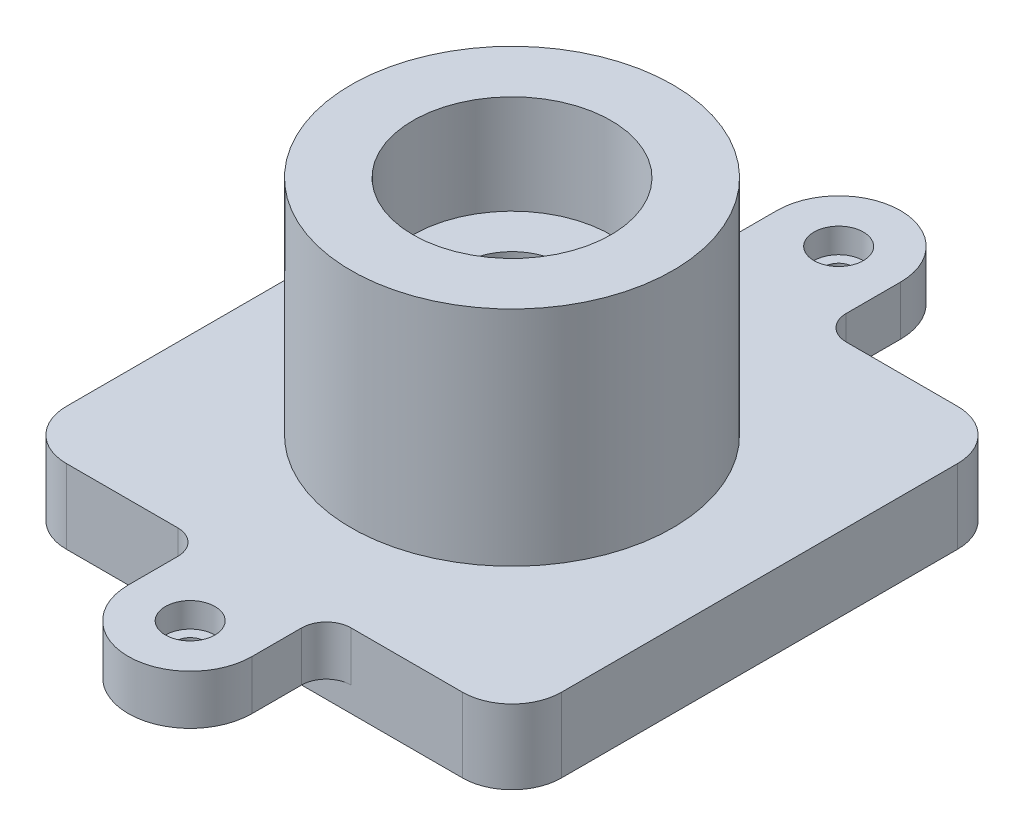
ISO-10303-21;
HEADER;
FILE_DESCRIPTION(('STEP AP214'),'2;1');
FILE_NAME('part.step','',(''),(''),'','','');
FILE_SCHEMA(('AUTOMOTIVE_DESIGN { 1 0 10303 214 1 1 1 1 }'));
ENDSEC;
DATA;
#1=APPLICATION_CONTEXT('core data for automotive mechanical design processes');
#2=APPLICATION_PROTOCOL_DEFINITION('international standard','automotive_design',2000,#1);
#3=PRODUCT_CONTEXT('',#1,'mechanical');
#4=PRODUCT('Part','Part','',(#3));
#5=PRODUCT_RELATED_PRODUCT_CATEGORY('part','',(#4));
#6=PRODUCT_DEFINITION_FORMATION('','',#4);
#7=PRODUCT_DEFINITION_CONTEXT('part definition',#1,'design');
#8=PRODUCT_DEFINITION('design','',#6,#7);
#9=PRODUCT_DEFINITION_SHAPE('','',#8);
#10=(LENGTH_UNIT() NAMED_UNIT(*) SI_UNIT(.MILLI.,.METRE.));
#11=(NAMED_UNIT(*) PLANE_ANGLE_UNIT() SI_UNIT($,.RADIAN.));
#12=(NAMED_UNIT(*) SI_UNIT($,.STERADIAN.) SOLID_ANGLE_UNIT());
#13=UNCERTAINTY_MEASURE_WITH_UNIT(LENGTH_MEASURE(1.E-05),#10,'distance_accuracy_value','');
#14=(GEOMETRIC_REPRESENTATION_CONTEXT(3) GLOBAL_UNCERTAINTY_ASSIGNED_CONTEXT((#13)) GLOBAL_UNIT_ASSIGNED_CONTEXT((#10,
#11,#12)) REPRESENTATION_CONTEXT('',''));
#15=CARTESIAN_POINT('',(0.,0.,0.));
#16=DIRECTION('',(0.,0.,1.));
#17=DIRECTION('',(1.,0.,0.));
#18=AXIS2_PLACEMENT_3D('',#15,#16,#17);
#19=CARTESIAN_POINT('',(0.,15.,0.));
#20=DIRECTION('',(0.,0.,-1.));
#21=DIRECTION('',(-1.,0.,0.));
#22=AXIS2_PLACEMENT_3D('',#19,#20,#21);
#23=PLANE('',#22);
#24=DIRECTION('',(1.,0.,0.));
#25=VECTOR('',#24,1.);
#26=CARTESIAN_POINT('',(0.,0.,0.));
#27=LINE('',#26,#25);
#28=CARTESIAN_POINT('',(10.,0.,0.));
#29=VERTEX_POINT('',#28);
#30=CARTESIAN_POINT('',(90.,0.,0.));
#31=VERTEX_POINT('',#30);
#32=EDGE_CURVE('E252',#29,#31,#27,.T.);
#33=ORIENTED_EDGE('',*,*,#32,.T.);
#34=DIRECTION('',(0.,-1.,0.));
#35=VECTOR('',#34,1.);
#36=CARTESIAN_POINT('',(90.,15.,0.));
#37=LINE('',#36,#35);
#38=CARTESIAN_POINT('',(90.,15.,0.));
#39=VERTEX_POINT('',#38);
#40=EDGE_CURVE('E321',#31,#39,#37,.F.);
#41=ORIENTED_EDGE('',*,*,#40,.T.);
#42=DIRECTION('',(1.,0.,0.));
#43=VECTOR('',#42,1.);
#44=CARTESIAN_POINT('',(0.,15.,0.));
#45=LINE('',#44,#43);
#46=CARTESIAN_POINT('',(67.5,15.,0.));
#47=VERTEX_POINT('',#46);
#48=EDGE_CURVE('E241',#47,#39,#45,.T.);
#49=ORIENTED_EDGE('',*,*,#48,.F.);
#50=DIRECTION('',(0.,1.,0.));
#51=VECTOR('',#50,1.);
#52=CARTESIAN_POINT('',(67.5,15.,0.));
#53=LINE('',#52,#51);
#54=CARTESIAN_POINT('',(67.5,5.00000000000001,0.));
#55=VERTEX_POINT('',#54);
#56=EDGE_CURVE('E271',#47,#55,#53,.F.);
#57=ORIENTED_EDGE('',*,*,#56,.T.);
#58=DIRECTION('',(-1.,0.,0.));
#59=VECTOR('',#58,1.);
#60=CARTESIAN_POINT('',(37.5,5.00000000000001,0.));
#61=LINE('',#60,#59);
#62=CARTESIAN_POINT('',(32.5,5.00000000000001,0.));
#63=VERTEX_POINT('',#62);
#64=EDGE_CURVE('E203',#55,#63,#61,.T.);
#65=ORIENTED_EDGE('',*,*,#64,.T.);
#66=DIRECTION('',(0.,1.,0.));
#67=VECTOR('',#66,1.);
#68=CARTESIAN_POINT('',(32.5,15.,0.));
#69=LINE('',#68,#67);
#70=CARTESIAN_POINT('',(32.5,15.,0.));
#71=VERTEX_POINT('',#70);
#72=EDGE_CURVE('E268',#63,#71,#69,.T.);
#73=ORIENTED_EDGE('',*,*,#72,.T.);
#74=CARTESIAN_POINT('',(10.,15.,0.));
#75=VERTEX_POINT('',#74);
#76=EDGE_CURVE('E243',#75,#71,#45,.T.);
#77=ORIENTED_EDGE('',*,*,#76,.F.);
#78=DIRECTION('',(0.,-1.,0.));
#79=VECTOR('',#78,1.);
#80=CARTESIAN_POINT('',(10.,15.,0.));
#81=LINE('',#80,#79);
#82=EDGE_CURVE('E318',#75,#29,#81,.T.);
#83=ORIENTED_EDGE('',*,*,#82,.T.);
#84=EDGE_LOOP('',(#33,#41,#49,#57,#65,#73,#77,#83));
#85=FACE_BOUND('',#84,.T.);
#86=ADVANCED_FACE('F37',(#85),#23,.F.);
#87=CARTESIAN_POINT('',(0.,15.,-100.));
#88=DIRECTION('',(0.,0.,1.));
#89=DIRECTION('',(1.,0.,0.));
#90=AXIS2_PLACEMENT_3D('',#87,#88,#89);
#91=PLANE('',#90);
#92=DIRECTION('',(-1.,0.,0.));
#93=VECTOR('',#92,1.);
#94=CARTESIAN_POINT('',(0.,15.,-100.));
#95=LINE('',#94,#93);
#96=CARTESIAN_POINT('',(90.,15.,-100.));
#97=VERTEX_POINT('',#96);
#98=CARTESIAN_POINT('',(67.5,15.,-100.));
#99=VERTEX_POINT('',#98);
#100=EDGE_CURVE('E248',#97,#99,#95,.T.);
#101=ORIENTED_EDGE('',*,*,#100,.F.);
#102=DIRECTION('',(0.,-1.,0.));
#103=VECTOR('',#102,1.);
#104=CARTESIAN_POINT('',(90.,15.,-100.));
#105=LINE('',#104,#103);
#106=CARTESIAN_POINT('',(90.,0.,-100.));
#107=VERTEX_POINT('',#106);
#108=EDGE_CURVE('E331',#97,#107,#105,.T.);
#109=ORIENTED_EDGE('',*,*,#108,.T.);
#110=DIRECTION('',(-1.,0.,0.));
#111=VECTOR('',#110,1.);
#112=CARTESIAN_POINT('',(0.,0.,-100.));
#113=LINE('',#112,#111);
#114=CARTESIAN_POINT('',(10.,0.,-100.));
#115=VERTEX_POINT('',#114);
#116=EDGE_CURVE('E242',#107,#115,#113,.T.);
#117=ORIENTED_EDGE('',*,*,#116,.T.);
#118=DIRECTION('',(0.,-1.,0.));
#119=VECTOR('',#118,1.);
#120=CARTESIAN_POINT('',(10.,15.,-100.));
#121=LINE('',#120,#119);
#122=CARTESIAN_POINT('',(10.,15.,-100.));
#123=VERTEX_POINT('',#122);
#124=EDGE_CURVE('E52',#115,#123,#121,.F.);
#125=ORIENTED_EDGE('',*,*,#124,.T.);
#126=CARTESIAN_POINT('',(32.5,15.,-100.));
#127=VERTEX_POINT('',#126);
#128=EDGE_CURVE('E247',#127,#123,#95,.T.);
#129=ORIENTED_EDGE('',*,*,#128,.F.);
#130=DIRECTION('',(0.,1.,0.));
#131=VECTOR('',#130,1.);
#132=CARTESIAN_POINT('',(32.5,15.,-100.));
#133=LINE('',#132,#131);
#134=CARTESIAN_POINT('',(32.5,5.00000000000001,-100.));
#135=VERTEX_POINT('',#134);
#136=EDGE_CURVE('E276',#127,#135,#133,.F.);
#137=ORIENTED_EDGE('',*,*,#136,.T.);
#138=DIRECTION('',(1.,0.,0.));
#139=VECTOR('',#138,1.);
#140=CARTESIAN_POINT('',(37.5,5.00000000000001,-100.));
#141=LINE('',#140,#139);
#142=CARTESIAN_POINT('',(67.5,5.00000000000001,-100.));
#143=VERTEX_POINT('',#142);
#144=EDGE_CURVE('E215',#135,#143,#141,.T.);
#145=ORIENTED_EDGE('',*,*,#144,.T.);
#146=DIRECTION('',(0.,1.,0.));
#147=VECTOR('',#146,1.);
#148=CARTESIAN_POINT('',(67.5,15.,-100.));
#149=LINE('',#148,#147);
#150=EDGE_CURVE('E279',#143,#99,#149,.T.);
#151=ORIENTED_EDGE('',*,*,#150,.T.);
#152=EDGE_LOOP('',(#101,#109,#117,#125,#129,#137,#145,#151));
#153=FACE_BOUND('',#152,.T.);
#154=ADVANCED_FACE('F366',(#153),#91,.F.);
#155=CARTESIAN_POINT('',(0.,15.,0.));
#156=DIRECTION('',(1.,0.,0.));
#157=DIRECTION('',(0.,0.,-1.));
#158=AXIS2_PLACEMENT_3D('',#155,#156,#157);
#159=PLANE('',#158);
#160=DIRECTION('',(0.,0.,1.));
#161=VECTOR('',#160,1.);
#162=CARTESIAN_POINT('',(0.,0.,0.));
#163=LINE('',#162,#161);
#164=CARTESIAN_POINT('',(0.,0.,-90.));
#165=VERTEX_POINT('',#164);
#166=CARTESIAN_POINT('',(0.,0.,-10.));
#167=VERTEX_POINT('',#166);
#168=EDGE_CURVE('E235',#165,#167,#163,.T.);
#169=ORIENTED_EDGE('',*,*,#168,.T.);
#170=DIRECTION('',(0.,-1.,0.));
#171=VECTOR('',#170,1.);
#172=CARTESIAN_POINT('',(0.,15.,-10.));
#173=LINE('',#172,#171);
#174=CARTESIAN_POINT('',(0.,15.,-10.));
#175=VERTEX_POINT('',#174);
#176=EDGE_CURVE('E45',#167,#175,#173,.F.);
#177=ORIENTED_EDGE('',*,*,#176,.T.);
#178=DIRECTION('',(0.,0.,1.));
#179=VECTOR('',#178,1.);
#180=CARTESIAN_POINT('',(0.,15.,0.));
#181=LINE('',#180,#179);
#182=CARTESIAN_POINT('',(0.,15.,-90.));
#183=VERTEX_POINT('',#182);
#184=EDGE_CURVE('E238',#183,#175,#181,.T.);
#185=ORIENTED_EDGE('',*,*,#184,.F.);
#186=DIRECTION('',(0.,-1.,0.));
#187=VECTOR('',#186,1.);
#188=CARTESIAN_POINT('',(0.,15.,-90.));
#189=LINE('',#188,#187);
#190=EDGE_CURVE('E334',#183,#165,#189,.T.);
#191=ORIENTED_EDGE('',*,*,#190,.T.);
#192=EDGE_LOOP('',(#169,#177,#185,#191));
#193=FACE_BOUND('',#192,.T.);
#194=ADVANCED_FACE('F339',(#193),#159,.F.);
#195=CARTESIAN_POINT('',(100.,15.,0.));
#196=DIRECTION('',(-1.,0.,0.));
#197=DIRECTION('',(0.,0.,1.));
#198=AXIS2_PLACEMENT_3D('',#195,#196,#197);
#199=PLANE('',#198);
#200=DIRECTION('',(0.,0.,-1.));
#201=VECTOR('',#200,1.);
#202=CARTESIAN_POINT('',(100.,15.,0.));
#203=LINE('',#202,#201);
#204=CARTESIAN_POINT('',(100.,15.,-10.));
#205=VERTEX_POINT('',#204);
#206=CARTESIAN_POINT('',(100.,15.,-90.));
#207=VERTEX_POINT('',#206);
#208=EDGE_CURVE('E245',#205,#207,#203,.T.);
#209=ORIENTED_EDGE('',*,*,#208,.F.);
#210=DIRECTION('',(0.,-1.,0.));
#211=VECTOR('',#210,1.);
#212=CARTESIAN_POINT('',(100.,15.,-10.));
#213=LINE('',#212,#211);
#214=CARTESIAN_POINT('',(100.,0.,-10.));
#215=VERTEX_POINT('',#214);
#216=EDGE_CURVE('E307',#205,#215,#213,.T.);
#217=ORIENTED_EDGE('',*,*,#216,.T.);
#218=DIRECTION('',(0.,0.,-1.));
#219=VECTOR('',#218,1.);
#220=CARTESIAN_POINT('',(100.,0.,0.));
#221=LINE('',#220,#219);
#222=CARTESIAN_POINT('',(100.,0.,-90.));
#223=VERTEX_POINT('',#222);
#224=EDGE_CURVE('E255',#215,#223,#221,.T.);
#225=ORIENTED_EDGE('',*,*,#224,.T.);
#226=DIRECTION('',(0.,-1.,0.));
#227=VECTOR('',#226,1.);
#228=CARTESIAN_POINT('',(100.,15.,-90.));
#229=LINE('',#228,#227);
#230=EDGE_CURVE('E305',#223,#207,#229,.F.);
#231=ORIENTED_EDGE('',*,*,#230,.T.);
#232=EDGE_LOOP('',(#209,#217,#225,#231));
#233=FACE_BOUND('',#232,.T.);
#234=ADVANCED_FACE('F360',(#233),#199,.F.);
#235=CARTESIAN_POINT('',(0.,15.,0.));
#236=DIRECTION('',(0.,-1.,0.));
#237=DIRECTION('',(0.,0.,-1.));
#238=AXIS2_PLACEMENT_3D('',#235,#236,#237);
#239=PLANE('',#238);
#240=CARTESIAN_POINT('',(50.,15.,-50.));
#241=DIRECTION('',(0.,-1.,0.));
#242=DIRECTION('',(0.,0.,-1.));
#243=AXIS2_PLACEMENT_3D('',#240,#241,#242);
#244=CIRCLE('',#243,32.5);
#245=CARTESIAN_POINT('',(50.,15.,-82.5));
#246=VERTEX_POINT('',#245);
#247=EDGE_CURVE('E11',#246,#246,#244,.F.);
#248=ORIENTED_EDGE('',*,*,#247,.F.);
#249=EDGE_LOOP('',(#248));
#250=FACE_BOUND('',#249,.T.);
#251=CARTESIAN_POINT('',(50.,15.,-115.975098947511));
#252=DIRECTION('',(0.,1.,0.));
#253=DIRECTION('',(0.,0.,1.));
#254=AXIS2_PLACEMENT_3D('',#251,#252,#253);
#255=CIRCLE('',#254,4.99999999999999);
#256=CARTESIAN_POINT('',(50.,15.,-110.975098947511));
#257=VERTEX_POINT('',#256);
#258=EDGE_CURVE('E782',#257,#257,#255,.T.);
#259=ORIENTED_EDGE('',*,*,#258,.F.);
#260=EDGE_LOOP('',(#259));
#261=FACE_BOUND('',#260,.T.);
#262=CARTESIAN_POINT('',(50.,15.,15.));
#263=DIRECTION('',(0.,1.,0.));
#264=DIRECTION('',(0.,0.,1.));
#265=AXIS2_PLACEMENT_3D('',#262,#263,#264);
#266=CIRCLE('',#265,5.);
#267=CARTESIAN_POINT('',(50.,15.,20.));
#268=VERTEX_POINT('',#267);
#269=EDGE_CURVE('E265',#268,#268,#266,.T.);
#270=ORIENTED_EDGE('',*,*,#269,.F.);
#271=EDGE_LOOP('',(#270));
#272=FACE_BOUND('',#271,.T.);
#273=ORIENTED_EDGE('',*,*,#48,.T.);
#274=CARTESIAN_POINT('',(90.,15.,-10.));
#275=DIRECTION('',(0.,-1.,0.));
#276=DIRECTION('',(0.,0.,-1.));
#277=AXIS2_PLACEMENT_3D('',#274,#275,#276);
#278=CIRCLE('',#277,10.);
#279=EDGE_CURVE('E328',#39,#205,#278,.F.);
#280=ORIENTED_EDGE('',*,*,#279,.T.);
#281=ORIENTED_EDGE('',*,*,#208,.T.);
#282=CARTESIAN_POINT('',(90.,15.,-90.));
#283=DIRECTION('',(0.,-1.,0.));
#284=DIRECTION('',(0.,0.,-1.));
#285=AXIS2_PLACEMENT_3D('',#282,#283,#284);
#286=CIRCLE('',#285,10.);
#287=EDGE_CURVE('E60',#207,#97,#286,.F.);
#288=ORIENTED_EDGE('',*,*,#287,.T.);
#289=ORIENTED_EDGE('',*,*,#100,.T.);
#290=CARTESIAN_POINT('',(67.5,15.,-105.));
#291=DIRECTION('',(0.,-1.,0.));
#292=DIRECTION('',(0.,0.,-1.));
#293=AXIS2_PLACEMENT_3D('',#290,#291,#292);
#294=CIRCLE('',#293,5.);
#295=CARTESIAN_POINT('',(62.5,15.,-105.));
#296=VERTEX_POINT('',#295);
#297=EDGE_CURVE('E296',#99,#296,#294,.T.);
#298=ORIENTED_EDGE('',*,*,#297,.T.);
#299=DIRECTION('',(0.,0.,-1.));
#300=VECTOR('',#299,1.);
#301=CARTESIAN_POINT('',(62.5,15.,-100.));
#302=LINE('',#301,#300);
#303=CARTESIAN_POINT('',(62.5,15.,-115.975098947511));
#304=VERTEX_POINT('',#303);
#305=EDGE_CURVE('E210',#296,#304,#302,.T.);
#306=ORIENTED_EDGE('',*,*,#305,.T.);
#307=CARTESIAN_POINT('',(50.,15.,-115.975098947511));
#308=DIRECTION('',(0.,1.,0.));
#309=DIRECTION('',(0.,0.,1.));
#310=AXIS2_PLACEMENT_3D('',#307,#308,#309);
#311=CIRCLE('',#310,12.5);
#312=CARTESIAN_POINT('',(37.5,15.,-115.975098947511));
#313=VERTEX_POINT('',#312);
#314=EDGE_CURVE('E228',#304,#313,#311,.T.);
#315=ORIENTED_EDGE('',*,*,#314,.T.);
#316=DIRECTION('',(0.,0.,1.));
#317=VECTOR('',#316,1.);
#318=CARTESIAN_POINT('',(37.5,15.,-100.));
#319=LINE('',#318,#317);
#320=CARTESIAN_POINT('',(37.5,15.,-105.));
#321=VERTEX_POINT('',#320);
#322=EDGE_CURVE('E218',#313,#321,#319,.T.);
#323=ORIENTED_EDGE('',*,*,#322,.T.);
#324=CARTESIAN_POINT('',(32.5,15.,-105.));
#325=DIRECTION('',(0.,-1.,0.));
#326=DIRECTION('',(0.,0.,-1.));
#327=AXIS2_PLACEMENT_3D('',#324,#325,#326);
#328=CIRCLE('',#327,5.);
#329=EDGE_CURVE('E301',#321,#127,#328,.T.);
#330=ORIENTED_EDGE('',*,*,#329,.T.);
#331=ORIENTED_EDGE('',*,*,#128,.T.);
#332=CARTESIAN_POINT('',(10.,15.,-90.));
#333=DIRECTION('',(0.,-1.,0.));
#334=DIRECTION('',(0.,0.,-1.));
#335=AXIS2_PLACEMENT_3D('',#332,#333,#334);
#336=CIRCLE('',#335,10.);
#337=EDGE_CURVE('E323',#123,#183,#336,.F.);
#338=ORIENTED_EDGE('',*,*,#337,.T.);
#339=ORIENTED_EDGE('',*,*,#184,.T.);
#340=CARTESIAN_POINT('',(10.,15.,-10.));
#341=DIRECTION('',(0.,-1.,0.));
#342=DIRECTION('',(0.,0.,-1.));
#343=AXIS2_PLACEMENT_3D('',#340,#341,#342);
#344=CIRCLE('',#343,10.);
#345=EDGE_CURVE('E325',#175,#75,#344,.F.);
#346=ORIENTED_EDGE('',*,*,#345,.T.);
#347=ORIENTED_EDGE('',*,*,#76,.T.);
#348=CARTESIAN_POINT('',(32.5,15.,5.));
#349=DIRECTION('',(0.,-1.,0.));
#350=DIRECTION('',(0.,0.,-1.));
#351=AXIS2_PLACEMENT_3D('',#348,#349,#350);
#352=CIRCLE('',#351,5.);
#353=CARTESIAN_POINT('',(37.5,15.,5.));
#354=VERTEX_POINT('',#353);
#355=EDGE_CURVE('E291',#71,#354,#352,.T.);
#356=ORIENTED_EDGE('',*,*,#355,.T.);
#357=DIRECTION('',(0.,0.,1.));
#358=VECTOR('',#357,1.);
#359=CARTESIAN_POINT('',(37.5,15.,0.));
#360=LINE('',#359,#358);
#361=CARTESIAN_POINT('',(37.5,15.,15.));
#362=VERTEX_POINT('',#361);
#363=EDGE_CURVE('E196',#354,#362,#360,.T.);
#364=ORIENTED_EDGE('',*,*,#363,.T.);
#365=CARTESIAN_POINT('',(50.,15.,15.));
#366=DIRECTION('',(0.,1.,0.));
#367=DIRECTION('',(0.,0.,1.));
#368=AXIS2_PLACEMENT_3D('',#365,#366,#367);
#369=CIRCLE('',#368,12.5);
#370=CARTESIAN_POINT('',(62.5,15.,15.));
#371=VERTEX_POINT('',#370);
#372=EDGE_CURVE('E181',#362,#371,#369,.T.);
#373=ORIENTED_EDGE('',*,*,#372,.T.);
#374=DIRECTION('',(0.,0.,-1.));
#375=VECTOR('',#374,1.);
#376=CARTESIAN_POINT('',(62.5,15.,0.));
#377=LINE('',#376,#375);
#378=CARTESIAN_POINT('',(62.5,15.,4.99999999999999));
#379=VERTEX_POINT('',#378);
#380=EDGE_CURVE('E194',#371,#379,#377,.T.);
#381=ORIENTED_EDGE('',*,*,#380,.T.);
#382=CARTESIAN_POINT('',(67.5,15.,5.));
#383=DIRECTION('',(0.,-1.,0.));
#384=DIRECTION('',(0.,0.,-1.));
#385=AXIS2_PLACEMENT_3D('',#382,#383,#384);
#386=CIRCLE('',#385,5.);
#387=EDGE_CURVE('E287',#379,#47,#386,.T.);
#388=ORIENTED_EDGE('',*,*,#387,.T.);
#389=EDGE_LOOP('',(#273,#280,#281,#288,#289,#298,#306,#315,#323,#330,#331,#338,#339,#346,#347,
#356,#364,#373,#381,#388));
#390=FACE_BOUND('',#389,.T.);
#391=ADVANCED_FACE('F193',(#250,#261,#272,#390),#239,.F.);
#392=CARTESIAN_POINT('',(0.,0.,0.));
#393=DIRECTION('',(0.,-1.,0.));
#394=DIRECTION('',(0.,0.,-1.));
#395=AXIS2_PLACEMENT_3D('',#392,#393,#394);
#396=PLANE('',#395);
#397=CARTESIAN_POINT('',(50.,0.,-50.));
#398=DIRECTION('',(0.,1.,0.));
#399=DIRECTION('',(0.,0.,1.));
#400=AXIS2_PLACEMENT_3D('',#397,#398,#399);
#401=CIRCLE('',#400,9.99999999999999);
#402=CARTESIAN_POINT('',(50.,0.,-40.));
#403=VERTEX_POINT('',#402);
#404=EDGE_CURVE('E788',#403,#403,#401,.T.);
#405=ORIENTED_EDGE('',*,*,#404,.T.);
#406=EDGE_LOOP('',(#405));
#407=FACE_BOUND('',#406,.T.);
#408=ORIENTED_EDGE('',*,*,#224,.F.);
#409=CARTESIAN_POINT('',(90.,0.,-10.));
#410=DIRECTION('',(0.,-1.,0.));
#411=DIRECTION('',(0.,0.,-1.));
#412=AXIS2_PLACEMENT_3D('',#409,#410,#411);
#413=CIRCLE('',#412,10.);
#414=EDGE_CURVE('E316',#215,#31,#413,.T.);
#415=ORIENTED_EDGE('',*,*,#414,.T.);
#416=ORIENTED_EDGE('',*,*,#32,.F.);
#417=CARTESIAN_POINT('',(10.,0.,-10.));
#418=DIRECTION('',(0.,-1.,0.));
#419=DIRECTION('',(0.,0.,-1.));
#420=AXIS2_PLACEMENT_3D('',#417,#418,#419);
#421=CIRCLE('',#420,10.);
#422=EDGE_CURVE('E312',#29,#167,#421,.T.);
#423=ORIENTED_EDGE('',*,*,#422,.T.);
#424=ORIENTED_EDGE('',*,*,#168,.F.);
#425=CARTESIAN_POINT('',(10.,0.,-90.));
#426=DIRECTION('',(0.,-1.,0.));
#427=DIRECTION('',(0.,0.,-1.));
#428=AXIS2_PLACEMENT_3D('',#425,#426,#427);
#429=CIRCLE('',#428,10.);
#430=EDGE_CURVE('E310',#165,#115,#429,.T.);
#431=ORIENTED_EDGE('',*,*,#430,.T.);
#432=ORIENTED_EDGE('',*,*,#116,.F.);
#433=CARTESIAN_POINT('',(90.,0.,-90.));
#434=DIRECTION('',(0.,-1.,0.));
#435=DIRECTION('',(0.,0.,-1.));
#436=AXIS2_PLACEMENT_3D('',#433,#434,#435);
#437=CIRCLE('',#436,10.);
#438=EDGE_CURVE('E314',#107,#223,#437,.T.);
#439=ORIENTED_EDGE('',*,*,#438,.T.);
#440=EDGE_LOOP('',(#408,#415,#416,#423,#424,#431,#432,#439));
#441=FACE_BOUND('',#440,.T.);
#442=ADVANCED_FACE('F353',(#407,#441),#396,.T.);
#443=CARTESIAN_POINT('',(37.5,5.00000000000001,-100.));
#444=DIRECTION('',(-1.,0.,0.));
#445=DIRECTION('',(0.,0.,1.));
#446=AXIS2_PLACEMENT_3D('',#443,#444,#445);
#447=PLANE('',#446);
#448=DIRECTION('',(0.,0.,1.));
#449=VECTOR('',#448,1.);
#450=CARTESIAN_POINT('',(37.5,5.00000000000001,-100.));
#451=LINE('',#450,#449);
#452=CARTESIAN_POINT('',(37.5,5.00000000000001,-115.975098947511));
#453=VERTEX_POINT('',#452);
#454=CARTESIAN_POINT('',(37.5,5.00000000000001,-105.));
#455=VERTEX_POINT('',#454);
#456=EDGE_CURVE('E223',#453,#455,#451,.T.);
#457=ORIENTED_EDGE('',*,*,#456,.T.);
#458=DIRECTION('',(0.,1.,0.));
#459=VECTOR('',#458,1.);
#460=CARTESIAN_POINT('',(37.5,5.00000000000001,-105.));
#461=LINE('',#460,#459);
#462=EDGE_CURVE('E284',#455,#321,#461,.T.);
#463=ORIENTED_EDGE('',*,*,#462,.T.);
#464=ORIENTED_EDGE('',*,*,#322,.F.);
#465=DIRECTION('',(0.,1.,0.));
#466=VECTOR('',#465,1.);
#467=CARTESIAN_POINT('',(37.5,5.00000000000001,-115.975098947511));
#468=LINE('',#467,#466);
#469=EDGE_CURVE('E233',#453,#313,#468,.T.);
#470=ORIENTED_EDGE('',*,*,#469,.F.);
#471=EDGE_LOOP('',(#457,#463,#464,#470));
#472=FACE_BOUND('',#471,.T.);
#473=ADVANCED_FACE('F451',(#472),#447,.T.);
#474=CARTESIAN_POINT('',(50.,5.00000000000001,-115.975098947511));
#475=DIRECTION('',(0.,1.,0.));
#476=DIRECTION('',(0.,0.,1.));
#477=AXIS2_PLACEMENT_3D('',#474,#475,#476);
#478=CYLINDRICAL_SURFACE('',#477,12.5);
#479=ORIENTED_EDGE('',*,*,#314,.F.);
#480=DIRECTION('',(0.,1.,0.));
#481=VECTOR('',#480,1.);
#482=CARTESIAN_POINT('',(62.5,5.00000000000001,-115.975098947511));
#483=LINE('',#482,#481);
#484=CARTESIAN_POINT('',(62.5,5.00000000000001,-115.975098947511));
#485=VERTEX_POINT('',#484);
#486=EDGE_CURVE('E226',#485,#304,#483,.T.);
#487=ORIENTED_EDGE('',*,*,#486,.F.);
#488=CARTESIAN_POINT('',(50.,5.00000000000001,-115.975098947511));
#489=DIRECTION('',(0.,1.,0.));
#490=DIRECTION('',(0.,0.,1.));
#491=AXIS2_PLACEMENT_3D('',#488,#489,#490);
#492=CIRCLE('',#491,12.5);
#493=EDGE_CURVE('E220',#485,#453,#492,.T.);
#494=ORIENTED_EDGE('',*,*,#493,.T.);
#495=ORIENTED_EDGE('',*,*,#469,.T.);
#496=EDGE_LOOP('',(#479,#487,#494,#495));
#497=FACE_BOUND('',#496,.T.);
#498=ADVANCED_FACE('F652',(#497),#478,.T.);
#499=CARTESIAN_POINT('',(62.5,5.00000000000001,-100.));
#500=DIRECTION('',(1.,0.,0.));
#501=DIRECTION('',(0.,0.,-1.));
#502=AXIS2_PLACEMENT_3D('',#499,#500,#501);
#503=PLANE('',#502);
#504=ORIENTED_EDGE('',*,*,#305,.F.);
#505=DIRECTION('',(0.,1.,0.));
#506=VECTOR('',#505,1.);
#507=CARTESIAN_POINT('',(62.5,5.00000000000001,-105.));
#508=LINE('',#507,#506);
#509=CARTESIAN_POINT('',(62.5,5.00000000000001,-105.));
#510=VERTEX_POINT('',#509);
#511=EDGE_CURVE('E282',#296,#510,#508,.F.);
#512=ORIENTED_EDGE('',*,*,#511,.T.);
#513=DIRECTION('',(0.,0.,-1.));
#514=VECTOR('',#513,1.);
#515=CARTESIAN_POINT('',(62.5,5.00000000000001,-100.));
#516=LINE('',#515,#514);
#517=EDGE_CURVE('E217',#510,#485,#516,.T.);
#518=ORIENTED_EDGE('',*,*,#517,.T.);
#519=ORIENTED_EDGE('',*,*,#486,.T.);
#520=EDGE_LOOP('',(#504,#512,#518,#519));
#521=FACE_BOUND('',#520,.T.);
#522=ADVANCED_FACE('F642',(#521),#503,.T.);
#523=CARTESIAN_POINT('',(50.,5.00000000000001,-115.975098947511));
#524=DIRECTION('',(0.,1.,0.));
#525=DIRECTION('',(0.,0.,1.));
#526=AXIS2_PLACEMENT_3D('',#523,#524,#525);
#527=PLANE('',#526);
#528=CARTESIAN_POINT('',(50.,5.00000000000001,-115.975098947511));
#529=DIRECTION('',(0.,1.,0.));
#530=DIRECTION('',(0.,0.,1.));
#531=AXIS2_PLACEMENT_3D('',#528,#529,#530);
#532=CIRCLE('',#531,2.9);
#533=CARTESIAN_POINT('',(50.,5.00000000000001,-113.075098947511));
#534=VERTEX_POINT('',#533);
#535=EDGE_CURVE('E262',#534,#534,#532,.T.);
#536=ORIENTED_EDGE('',*,*,#535,.T.);
#537=EDGE_LOOP('',(#536));
#538=FACE_BOUND('',#537,.T.);
#539=ORIENTED_EDGE('',*,*,#144,.F.);
#540=CARTESIAN_POINT('',(32.5,5.00000000000001,-105.));
#541=DIRECTION('',(0.,1.,0.));
#542=DIRECTION('',(0.,0.,1.));
#543=AXIS2_PLACEMENT_3D('',#540,#541,#542);
#544=CIRCLE('',#543,5.);
#545=EDGE_CURVE('E303',#135,#455,#544,.T.);
#546=ORIENTED_EDGE('',*,*,#545,.T.);
#547=ORIENTED_EDGE('',*,*,#456,.F.);
#548=ORIENTED_EDGE('',*,*,#493,.F.);
#549=ORIENTED_EDGE('',*,*,#517,.F.);
#550=CARTESIAN_POINT('',(67.5,5.00000000000001,-105.));
#551=DIRECTION('',(0.,1.,0.));
#552=DIRECTION('',(0.,0.,1.));
#553=AXIS2_PLACEMENT_3D('',#550,#551,#552);
#554=CIRCLE('',#553,5.);
#555=EDGE_CURVE('E298',#510,#143,#554,.T.);
#556=ORIENTED_EDGE('',*,*,#555,.T.);
#557=EDGE_LOOP('',(#539,#546,#547,#548,#549,#556));
#558=FACE_BOUND('',#557,.T.);
#559=ADVANCED_FACE('F633',(#538,#558),#527,.F.);
#560=CARTESIAN_POINT('',(62.5,5.00000000000001,0.));
#561=DIRECTION('',(1.,0.,0.));
#562=DIRECTION('',(0.,0.,-1.));
#563=AXIS2_PLACEMENT_3D('',#560,#561,#562);
#564=PLANE('',#563);
#565=DIRECTION('',(0.,0.,-1.));
#566=VECTOR('',#565,1.);
#567=CARTESIAN_POINT('',(62.5,5.00000000000001,0.));
#568=LINE('',#567,#566);
#569=CARTESIAN_POINT('',(62.5,5.00000000000001,15.));
#570=VERTEX_POINT('',#569);
#571=CARTESIAN_POINT('',(62.5,5.00000000000001,4.99999999999999));
#572=VERTEX_POINT('',#571);
#573=EDGE_CURVE('E211',#570,#572,#568,.T.);
#574=ORIENTED_EDGE('',*,*,#573,.T.);
#575=DIRECTION('',(0.,1.,0.));
#576=VECTOR('',#575,1.);
#577=CARTESIAN_POINT('',(62.5,5.00000000000001,5.));
#578=LINE('',#577,#576);
#579=EDGE_CURVE('E202',#572,#379,#578,.T.);
#580=ORIENTED_EDGE('',*,*,#579,.T.);
#581=ORIENTED_EDGE('',*,*,#380,.F.);
#582=DIRECTION('',(0.,1.,0.));
#583=VECTOR('',#582,1.);
#584=CARTESIAN_POINT('',(62.5,5.00000000000001,15.));
#585=LINE('',#584,#583);
#586=EDGE_CURVE('E177',#570,#371,#585,.T.);
#587=ORIENTED_EDGE('',*,*,#586,.F.);
#588=EDGE_LOOP('',(#574,#580,#581,#587));
#589=FACE_BOUND('',#588,.T.);
#590=ADVANCED_FACE('F200',(#589),#564,.T.);
#591=CARTESIAN_POINT('',(50.,5.00000000000001,15.));
#592=DIRECTION('',(0.,1.,0.));
#593=DIRECTION('',(0.,0.,1.));
#594=AXIS2_PLACEMENT_3D('',#591,#592,#593);
#595=CYLINDRICAL_SURFACE('',#594,12.5);
#596=ORIENTED_EDGE('',*,*,#372,.F.);
#597=DIRECTION('',(0.,1.,0.));
#598=VECTOR('',#597,1.);
#599=CARTESIAN_POINT('',(37.5,5.00000000000001,15.));
#600=LINE('',#599,#598);
#601=CARTESIAN_POINT('',(37.5,5.00000000000001,15.));
#602=VERTEX_POINT('',#601);
#603=EDGE_CURVE('E188',#602,#362,#600,.T.);
#604=ORIENTED_EDGE('',*,*,#603,.F.);
#605=CARTESIAN_POINT('',(50.,5.00000000000001,15.));
#606=DIRECTION('',(0.,1.,0.));
#607=DIRECTION('',(0.,0.,1.));
#608=AXIS2_PLACEMENT_3D('',#605,#606,#607);
#609=CIRCLE('',#608,12.5);
#610=EDGE_CURVE('E183',#602,#570,#609,.T.);
#611=ORIENTED_EDGE('',*,*,#610,.T.);
#612=ORIENTED_EDGE('',*,*,#586,.T.);
#613=EDGE_LOOP('',(#596,#604,#611,#612));
#614=FACE_BOUND('',#613,.T.);
#615=ADVANCED_FACE('F179',(#614),#595,.T.);
#616=CARTESIAN_POINT('',(37.5,5.00000000000001,0.));
#617=DIRECTION('',(-1.,0.,0.));
#618=DIRECTION('',(0.,0.,1.));
#619=AXIS2_PLACEMENT_3D('',#616,#617,#618);
#620=PLANE('',#619);
#621=ORIENTED_EDGE('',*,*,#363,.F.);
#622=DIRECTION('',(0.,1.,0.));
#623=VECTOR('',#622,1.);
#624=CARTESIAN_POINT('',(37.5,5.00000000000001,5.));
#625=LINE('',#624,#623);
#626=CARTESIAN_POINT('',(37.5,5.00000000000001,5.));
#627=VERTEX_POINT('',#626);
#628=EDGE_CURVE('E274',#354,#627,#625,.F.);
#629=ORIENTED_EDGE('',*,*,#628,.T.);
#630=DIRECTION('',(0.,0.,1.));
#631=VECTOR('',#630,1.);
#632=CARTESIAN_POINT('',(37.5,5.00000000000001,0.));
#633=LINE('',#632,#631);
#634=EDGE_CURVE('E205',#627,#602,#633,.T.);
#635=ORIENTED_EDGE('',*,*,#634,.T.);
#636=ORIENTED_EDGE('',*,*,#603,.T.);
#637=EDGE_LOOP('',(#621,#629,#635,#636));
#638=FACE_BOUND('',#637,.T.);
#639=ADVANCED_FACE('F606',(#638),#620,.T.);
#640=CARTESIAN_POINT('',(50.,5.00000000000001,15.));
#641=DIRECTION('',(0.,1.,0.));
#642=DIRECTION('',(0.,0.,1.));
#643=AXIS2_PLACEMENT_3D('',#640,#641,#642);
#644=PLANE('',#643);
#645=CARTESIAN_POINT('',(50.,5.00000000000001,15.));
#646=DIRECTION('',(0.,1.,0.));
#647=DIRECTION('',(0.,0.,1.));
#648=AXIS2_PLACEMENT_3D('',#645,#646,#647);
#649=CIRCLE('',#648,2.9);
#650=CARTESIAN_POINT('',(50.,5.00000000000001,17.9));
#651=VERTEX_POINT('',#650);
#652=EDGE_CURVE('E189',#651,#651,#649,.T.);
#653=ORIENTED_EDGE('',*,*,#652,.T.);
#654=EDGE_LOOP('',(#653));
#655=FACE_BOUND('',#654,.T.);
#656=ORIENTED_EDGE('',*,*,#64,.F.);
#657=CARTESIAN_POINT('',(67.5,5.00000000000001,5.));
#658=DIRECTION('',(0.,1.,0.));
#659=DIRECTION('',(0.,0.,1.));
#660=AXIS2_PLACEMENT_3D('',#657,#658,#659);
#661=CIRCLE('',#660,5.);
#662=EDGE_CURVE('E289',#55,#572,#661,.T.);
#663=ORIENTED_EDGE('',*,*,#662,.T.);
#664=ORIENTED_EDGE('',*,*,#573,.F.);
#665=ORIENTED_EDGE('',*,*,#610,.F.);
#666=ORIENTED_EDGE('',*,*,#634,.F.);
#667=CARTESIAN_POINT('',(32.5,5.00000000000001,5.));
#668=DIRECTION('',(0.,1.,0.));
#669=DIRECTION('',(0.,0.,1.));
#670=AXIS2_PLACEMENT_3D('',#667,#668,#669);
#671=CIRCLE('',#670,5.);
#672=EDGE_CURVE('E293',#627,#63,#671,.T.);
#673=ORIENTED_EDGE('',*,*,#672,.T.);
#674=EDGE_LOOP('',(#656,#663,#664,#665,#666,#673));
#675=FACE_BOUND('',#674,.T.);
#676=ADVANCED_FACE('F596',(#655,#675),#644,.F.);
#677=CARTESIAN_POINT('',(50.,15.,15.));
#678=DIRECTION('',(0.,1.,0.));
#679=DIRECTION('',(0.,0.,1.));
#680=AXIS2_PLACEMENT_3D('',#677,#678,#679);
#681=CYLINDRICAL_SURFACE('',#680,2.9);
#682=CARTESIAN_POINT('',(50.,10.,15.));
#683=DIRECTION('',(0.,1.,0.));
#684=DIRECTION('',(0.,0.,1.));
#685=AXIS2_PLACEMENT_3D('',#682,#683,#684);
#686=CIRCLE('',#685,2.9);
#687=CARTESIAN_POINT('',(50.,10.,17.9));
#688=VERTEX_POINT('',#687);
#689=EDGE_CURVE('E261',#688,#688,#686,.T.);
#690=ORIENTED_EDGE('',*,*,#689,.T.);
#691=EDGE_LOOP('',(#690));
#692=FACE_BOUND('',#691,.T.);
#693=ORIENTED_EDGE('',*,*,#652,.F.);
#694=EDGE_LOOP('',(#693));
#695=FACE_BOUND('',#694,.T.);
#696=ADVANCED_FACE('F586',(#692,#695),#681,.F.);
#697=CARTESIAN_POINT('',(52.9,10.,15.));
#698=DIRECTION('',(0.,-1.,0.));
#699=DIRECTION('',(0.,0.,-1.));
#700=AXIS2_PLACEMENT_3D('',#697,#698,#699);
#701=PLANE('',#700);
#702=ORIENTED_EDGE('',*,*,#689,.F.);
#703=EDGE_LOOP('',(#702));
#704=FACE_BOUND('',#703,.T.);
#705=CARTESIAN_POINT('',(50.,10.,15.));
#706=DIRECTION('',(0.,1.,0.));
#707=DIRECTION('',(0.,0.,1.));
#708=AXIS2_PLACEMENT_3D('',#705,#706,#707);
#709=CIRCLE('',#708,5.);
#710=CARTESIAN_POINT('',(50.,10.,20.));
#711=VERTEX_POINT('',#710);
#712=EDGE_CURVE('E772',#711,#711,#709,.T.);
#713=ORIENTED_EDGE('',*,*,#712,.T.);
#714=EDGE_LOOP('',(#713));
#715=FACE_BOUND('',#714,.T.);
#716=ADVANCED_FACE('F576',(#704,#715),#701,.F.);
#717=CARTESIAN_POINT('',(50.,15.,15.));
#718=DIRECTION('',(0.,1.,0.));
#719=DIRECTION('',(0.,0.,1.));
#720=AXIS2_PLACEMENT_3D('',#717,#718,#719);
#721=CYLINDRICAL_SURFACE('',#720,5.);
#722=ORIENTED_EDGE('',*,*,#712,.F.);
#723=EDGE_LOOP('',(#722));
#724=FACE_BOUND('',#723,.T.);
#725=ORIENTED_EDGE('',*,*,#269,.T.);
#726=EDGE_LOOP('',(#725));
#727=FACE_BOUND('',#726,.T.);
#728=ADVANCED_FACE('F566',(#724,#727),#721,.F.);
#729=CARTESIAN_POINT('',(50.,15.,-115.975098947511));
#730=DIRECTION('',(0.,1.,0.));
#731=DIRECTION('',(0.,0.,1.));
#732=AXIS2_PLACEMENT_3D('',#729,#730,#731);
#733=CYLINDRICAL_SURFACE('',#732,2.9);
#734=CARTESIAN_POINT('',(50.,10.,-115.975098947511));
#735=DIRECTION('',(0.,1.,0.));
#736=DIRECTION('',(0.,0.,1.));
#737=AXIS2_PLACEMENT_3D('',#734,#735,#736);
#738=CIRCLE('',#737,2.9);
#739=CARTESIAN_POINT('',(50.,10.,-113.075098947511));
#740=VERTEX_POINT('',#739);
#741=EDGE_CURVE('E266',#740,#740,#738,.T.);
#742=ORIENTED_EDGE('',*,*,#741,.T.);
#743=EDGE_LOOP('',(#742));
#744=FACE_BOUND('',#743,.T.);
#745=ORIENTED_EDGE('',*,*,#535,.F.);
#746=EDGE_LOOP('',(#745));
#747=FACE_BOUND('',#746,.T.);
#748=ADVANCED_FACE('F556',(#744,#747),#733,.F.);
#749=CARTESIAN_POINT('',(52.9,10.,-115.975098947511));
#750=DIRECTION('',(0.,-1.,0.));
#751=DIRECTION('',(0.,0.,-1.));
#752=AXIS2_PLACEMENT_3D('',#749,#750,#751);
#753=PLANE('',#752);
#754=ORIENTED_EDGE('',*,*,#741,.F.);
#755=EDGE_LOOP('',(#754));
#756=FACE_BOUND('',#755,.T.);
#757=CARTESIAN_POINT('',(50.,10.,-115.975098947511));
#758=DIRECTION('',(0.,1.,0.));
#759=DIRECTION('',(0.,0.,1.));
#760=AXIS2_PLACEMENT_3D('',#757,#758,#759);
#761=CIRCLE('',#760,4.99999999999999);
#762=CARTESIAN_POINT('',(50.,10.,-110.975098947511));
#763=VERTEX_POINT('',#762);
#764=EDGE_CURVE('E779',#763,#763,#761,.T.);
#765=ORIENTED_EDGE('',*,*,#764,.T.);
#766=EDGE_LOOP('',(#765));
#767=FACE_BOUND('',#766,.T.);
#768=ADVANCED_FACE('F546',(#756,#767),#753,.F.);
#769=CARTESIAN_POINT('',(50.,15.,-115.975098947511));
#770=DIRECTION('',(0.,1.,0.));
#771=DIRECTION('',(0.,0.,1.));
#772=AXIS2_PLACEMENT_3D('',#769,#770,#771);
#773=CYLINDRICAL_SURFACE('',#772,4.99999999999999);
#774=ORIENTED_EDGE('',*,*,#764,.F.);
#775=EDGE_LOOP('',(#774));
#776=FACE_BOUND('',#775,.T.);
#777=ORIENTED_EDGE('',*,*,#258,.T.);
#778=EDGE_LOOP('',(#777));
#779=FACE_BOUND('',#778,.T.);
#780=ADVANCED_FACE('F391',(#776,#779),#773,.F.);
#781=CARTESIAN_POINT('',(67.5,5.00000000000001,5.));
#782=DIRECTION('',(0.,1.,0.));
#783=DIRECTION('',(0.,0.,1.));
#784=AXIS2_PLACEMENT_3D('',#781,#782,#783);
#785=CYLINDRICAL_SURFACE('',#784,5.);
#786=ORIENTED_EDGE('',*,*,#662,.F.);
#787=ORIENTED_EDGE('',*,*,#56,.F.);
#788=ORIENTED_EDGE('',*,*,#387,.F.);
#789=ORIENTED_EDGE('',*,*,#579,.F.);
#790=EDGE_LOOP('',(#786,#787,#788,#789));
#791=FACE_BOUND('',#790,.T.);
#792=ADVANCED_FACE('F387',(#791),#785,.F.);
#793=CARTESIAN_POINT('',(32.5,15.,5.));
#794=DIRECTION('',(0.,1.,0.));
#795=DIRECTION('',(0.,0.,1.));
#796=AXIS2_PLACEMENT_3D('',#793,#794,#795);
#797=CYLINDRICAL_SURFACE('',#796,5.);
#798=ORIENTED_EDGE('',*,*,#672,.F.);
#799=ORIENTED_EDGE('',*,*,#628,.F.);
#800=ORIENTED_EDGE('',*,*,#355,.F.);
#801=ORIENTED_EDGE('',*,*,#72,.F.);
#802=EDGE_LOOP('',(#798,#799,#800,#801));
#803=FACE_BOUND('',#802,.T.);
#804=ADVANCED_FACE('F390',(#803),#797,.F.);
#805=CARTESIAN_POINT('',(67.5,15.,-105.));
#806=DIRECTION('',(0.,1.,0.));
#807=DIRECTION('',(0.,0.,1.));
#808=AXIS2_PLACEMENT_3D('',#805,#806,#807);
#809=CYLINDRICAL_SURFACE('',#808,5.);
#810=ORIENTED_EDGE('',*,*,#555,.F.);
#811=ORIENTED_EDGE('',*,*,#511,.F.);
#812=ORIENTED_EDGE('',*,*,#297,.F.);
#813=ORIENTED_EDGE('',*,*,#150,.F.);
#814=EDGE_LOOP('',(#810,#811,#812,#813));
#815=FACE_BOUND('',#814,.T.);
#816=ADVANCED_FACE('F395',(#815),#809,.F.);
#817=CARTESIAN_POINT('',(32.5,5.00000000000001,-105.));
#818=DIRECTION('',(0.,1.,0.));
#819=DIRECTION('',(0.,0.,1.));
#820=AXIS2_PLACEMENT_3D('',#817,#818,#819);
#821=CYLINDRICAL_SURFACE('',#820,5.);
#822=ORIENTED_EDGE('',*,*,#545,.F.);
#823=ORIENTED_EDGE('',*,*,#136,.F.);
#824=ORIENTED_EDGE('',*,*,#329,.F.);
#825=ORIENTED_EDGE('',*,*,#462,.F.);
#826=EDGE_LOOP('',(#822,#823,#824,#825));
#827=FACE_BOUND('',#826,.T.);
#828=ADVANCED_FACE('F399',(#827),#821,.F.);
#829=CARTESIAN_POINT('',(90.,15.,-10.));
#830=DIRECTION('',(0.,-1.,0.));
#831=DIRECTION('',(0.,0.,-1.));
#832=AXIS2_PLACEMENT_3D('',#829,#830,#831);
#833=CYLINDRICAL_SURFACE('',#832,10.);
#834=ORIENTED_EDGE('',*,*,#279,.F.);
#835=ORIENTED_EDGE('',*,*,#40,.F.);
#836=ORIENTED_EDGE('',*,*,#414,.F.);
#837=ORIENTED_EDGE('',*,*,#216,.F.);
#838=EDGE_LOOP('',(#834,#835,#836,#837));
#839=FACE_BOUND('',#838,.T.);
#840=ADVANCED_FACE('F357',(#839),#833,.T.);
#841=CARTESIAN_POINT('',(90.,15.,-90.));
#842=DIRECTION('',(0.,-1.,0.));
#843=DIRECTION('',(0.,0.,-1.));
#844=AXIS2_PLACEMENT_3D('',#841,#842,#843);
#845=CYLINDRICAL_SURFACE('',#844,10.);
#846=ORIENTED_EDGE('',*,*,#287,.F.);
#847=ORIENTED_EDGE('',*,*,#230,.F.);
#848=ORIENTED_EDGE('',*,*,#438,.F.);
#849=ORIENTED_EDGE('',*,*,#108,.F.);
#850=EDGE_LOOP('',(#846,#847,#848,#849));
#851=FACE_BOUND('',#850,.T.);
#852=ADVANCED_FACE('F364',(#851),#845,.T.);
#853=CARTESIAN_POINT('',(10.,15.,-10.));
#854=DIRECTION('',(0.,-1.,0.));
#855=DIRECTION('',(0.,0.,-1.));
#856=AXIS2_PLACEMENT_3D('',#853,#854,#855);
#857=CYLINDRICAL_SURFACE('',#856,10.);
#858=ORIENTED_EDGE('',*,*,#345,.F.);
#859=ORIENTED_EDGE('',*,*,#176,.F.);
#860=ORIENTED_EDGE('',*,*,#422,.F.);
#861=ORIENTED_EDGE('',*,*,#82,.F.);
#862=EDGE_LOOP('',(#858,#859,#860,#861));
#863=FACE_BOUND('',#862,.T.);
#864=ADVANCED_FACE('F347',(#863),#857,.T.);
#865=CARTESIAN_POINT('',(10.,15.,-90.));
#866=DIRECTION('',(0.,-1.,0.));
#867=DIRECTION('',(0.,0.,-1.));
#868=AXIS2_PLACEMENT_3D('',#865,#866,#867);
#869=CYLINDRICAL_SURFACE('',#868,10.);
#870=ORIENTED_EDGE('',*,*,#337,.F.);
#871=ORIENTED_EDGE('',*,*,#124,.F.);
#872=ORIENTED_EDGE('',*,*,#430,.F.);
#873=ORIENTED_EDGE('',*,*,#190,.F.);
#874=EDGE_LOOP('',(#870,#871,#872,#873));
#875=FACE_BOUND('',#874,.T.);
#876=ADVANCED_FACE('F39',(#875),#869,.T.);
#877=CARTESIAN_POINT('',(50.,60.,-50.));
#878=DIRECTION('',(0.,-1.,0.));
#879=DIRECTION('',(0.,0.,-1.));
#880=AXIS2_PLACEMENT_3D('',#877,#878,#879);
#881=CYLINDRICAL_SURFACE('',#880,32.5);
#882=CARTESIAN_POINT('',(50.,60.,-50.));
#883=DIRECTION('',(0.,1.,0.));
#884=DIRECTION('',(0.,0.,1.));
#885=AXIS2_PLACEMENT_3D('',#882,#883,#884);
#886=CIRCLE('',#885,32.5);
#887=CARTESIAN_POINT('',(50.,60.,-82.5));
#888=VERTEX_POINT('',#887);
#889=EDGE_CURVE('E785',#888,#888,#886,.T.);
#890=CARTESIAN_POINT('',(50.,60.,-82.5));
#891=CARTESIAN_POINT('',(50.,59.53125,-82.5));
#892=CARTESIAN_POINT('',(50.,59.0625,-82.5));
#893=CARTESIAN_POINT('',(50.,58.125,-82.5));
#894=CARTESIAN_POINT('',(50.,57.65625,-82.5));
#895=CARTESIAN_POINT('',(50.,56.71875,-82.5));
#896=CARTESIAN_POINT('',(50.,56.25,-82.5));
#897=CARTESIAN_POINT('',(50.,55.3125,-82.5));
#898=CARTESIAN_POINT('',(50.,54.84375,-82.5));
#899=CARTESIAN_POINT('',(50.,53.90625,-82.5));
#900=CARTESIAN_POINT('',(50.,53.4375,-82.5));
#901=CARTESIAN_POINT('',(50.,52.5,-82.5));
#902=CARTESIAN_POINT('',(50.,52.03125,-82.5));
#903=CARTESIAN_POINT('',(50.,51.09375,-82.5));
#904=CARTESIAN_POINT('',(50.,50.625,-82.5));
#905=CARTESIAN_POINT('',(50.,49.6875,-82.5));
#906=CARTESIAN_POINT('',(50.,49.21875,-82.5));
#907=CARTESIAN_POINT('',(50.,48.28125,-82.5));
#908=CARTESIAN_POINT('',(50.,47.8125,-82.5));
#909=CARTESIAN_POINT('',(50.,46.875,-82.5));
#910=CARTESIAN_POINT('',(50.,46.40625,-82.5));
#911=CARTESIAN_POINT('',(50.,45.46875,-82.5));
#912=CARTESIAN_POINT('',(50.,45.,-82.5));
#913=CARTESIAN_POINT('',(50.,44.0625,-82.5));
#914=CARTESIAN_POINT('',(50.,43.59375,-82.5));
#915=CARTESIAN_POINT('',(50.,42.65625,-82.5));
#916=CARTESIAN_POINT('',(50.,42.1875,-82.5));
#917=CARTESIAN_POINT('',(50.,41.25,-82.5));
#918=CARTESIAN_POINT('',(50.,40.78125,-82.5));
#919=CARTESIAN_POINT('',(50.,39.84375,-82.5));
#920=CARTESIAN_POINT('',(50.,39.375,-82.5));
#921=CARTESIAN_POINT('',(50.,38.4375,-82.5));
#922=CARTESIAN_POINT('',(50.,37.96875,-82.5));
#923=CARTESIAN_POINT('',(50.,37.03125,-82.5));
#924=CARTESIAN_POINT('',(50.,36.5625,-82.5));
#925=CARTESIAN_POINT('',(50.,35.625,-82.5));
#926=CARTESIAN_POINT('',(50.,35.15625,-82.5));
#927=CARTESIAN_POINT('',(50.,34.21875,-82.5));
#928=CARTESIAN_POINT('',(50.,33.75,-82.5));
#929=CARTESIAN_POINT('',(50.,32.8125,-82.5));
#930=CARTESIAN_POINT('',(50.,32.34375,-82.5));
#931=CARTESIAN_POINT('',(50.,31.40625,-82.5));
#932=CARTESIAN_POINT('',(50.,30.9375,-82.5));
#933=CARTESIAN_POINT('',(50.,30.,-82.5));
#934=CARTESIAN_POINT('',(50.,29.53125,-82.5));
#935=CARTESIAN_POINT('',(50.,28.59375,-82.5));
#936=CARTESIAN_POINT('',(50.,28.125,-82.5));
#937=CARTESIAN_POINT('',(50.,27.1875,-82.5));
#938=CARTESIAN_POINT('',(50.,26.71875,-82.5));
#939=CARTESIAN_POINT('',(50.,25.78125,-82.5));
#940=CARTESIAN_POINT('',(50.,25.3125,-82.5));
#941=CARTESIAN_POINT('',(50.,24.375,-82.5));
#942=CARTESIAN_POINT('',(50.,23.90625,-82.5));
#943=CARTESIAN_POINT('',(50.,22.96875,-82.5));
#944=CARTESIAN_POINT('',(50.,22.5,-82.5));
#945=CARTESIAN_POINT('',(50.,21.5625,-82.5));
#946=CARTESIAN_POINT('',(50.,21.09375,-82.5));
#947=CARTESIAN_POINT('',(50.,20.15625,-82.5));
#948=CARTESIAN_POINT('',(50.,19.6875,-82.5));
#949=CARTESIAN_POINT('',(50.,18.75,-82.5));
#950=CARTESIAN_POINT('',(50.,18.28125,-82.5));
#951=CARTESIAN_POINT('',(50.,17.34375,-82.5));
#952=CARTESIAN_POINT('',(50.,16.875,-82.5));
#953=CARTESIAN_POINT('',(50.,15.9375,-82.5));
#954=CARTESIAN_POINT('',(50.,15.46875,-82.5));
#955=CARTESIAN_POINT('',(50.,15.,-82.5));
#956=B_SPLINE_CURVE_WITH_KNOTS('',3,(#890,#891,#892,#893,#894,#895,#896,#897,#898,#899,#900,
#901,#902,#903,#904,#905,#906,#907,#908,#909,#910,#911,#912,#913,#914,#915,#916,#917,#918,#919,
#920,#921,#922,#923,#924,#925,#926,#927,#928,#929,#930,#931,#932,#933,#934,#935,#936,#937,#938,
#939,#940,#941,#942,#943,#944,#945,#946,#947,#948,#949,#950,#951,#952,#953,#954,#955),
.UNSPECIFIED.,.F.,.F.,(4,2,2,2,2,2,2,2,2,2,2,2,2,2,2,2,2,2,2,2,2,2,2,2,2,2,2,2,2,2,2,2,4),(0.,
1.40625,2.8125,4.21874999999999,5.625,7.03125,8.43749999999999,9.84374999999999,11.25,12.65625,
14.0625,15.46875,16.875,18.28125,19.6875,21.09375,22.5,23.90625,25.3125,26.71875,28.125,
29.53125,30.9375,32.34375,33.75,35.15625,36.5625,37.96875,39.375,40.78125,42.1875,43.59375,45.),.UNSPECIFIED.);
#957=EDGE_CURVE('BSEAM369',#888,#246,#956,.T.);
#958=ORIENTED_EDGE('',*,*,#889,.F.);
#959=ORIENTED_EDGE('',*,*,#247,.T.);
#960=ORIENTED_EDGE('',*,*,#957,.T.);
#961=ORIENTED_EDGE('',*,*,#957,.F.);
#962=EDGE_LOOP('',(#958,#960,#959,#961));
#963=FACE_BOUND('',#962,.T.);
#964=ADVANCED_FACE('F369',(#963),#881,.T.);
#965=CARTESIAN_POINT('',(50.,60.,-50.));
#966=DIRECTION('',(0.,1.,0.));
#967=DIRECTION('',(0.,0.,1.));
#968=AXIS2_PLACEMENT_3D('',#965,#966,#967);
#969=PLANE('',#968);
#970=CARTESIAN_POINT('',(50.,60.,-50.));
#971=DIRECTION('',(0.,1.,0.));
#972=DIRECTION('',(0.,0.,1.));
#973=AXIS2_PLACEMENT_3D('',#970,#971,#972);
#974=CIRCLE('',#973,20.);
#975=CARTESIAN_POINT('',(50.,60.,-30.));
#976=VERTEX_POINT('',#975);
#977=EDGE_CURVE('E797',#976,#976,#974,.T.);
#978=ORIENTED_EDGE('',*,*,#977,.F.);
#979=EDGE_LOOP('',(#978));
#980=FACE_BOUND('',#979,.T.);
#981=ORIENTED_EDGE('',*,*,#889,.T.);
#982=EDGE_LOOP('',(#981));
#983=FACE_BOUND('',#982,.T.);
#984=ADVANCED_FACE('F374',(#980,#983),#969,.T.);
#985=CARTESIAN_POINT('',(50.,60.,-50.));
#986=DIRECTION('',(0.,1.,0.));
#987=DIRECTION('',(0.,0.,1.));
#988=AXIS2_PLACEMENT_3D('',#985,#986,#987);
#989=CYLINDRICAL_SURFACE('',#988,9.99999999999999);
#990=ORIENTED_EDGE('',*,*,#404,.F.);
#991=EDGE_LOOP('',(#990));
#992=FACE_BOUND('',#991,.T.);
#993=CARTESIAN_POINT('',(50.,40.,-50.));
#994=DIRECTION('',(0.,1.,0.));
#995=DIRECTION('',(0.,0.,1.));
#996=AXIS2_PLACEMENT_3D('',#993,#994,#995);
#997=CIRCLE('',#996,10.);
#998=CARTESIAN_POINT('',(50.,40.,-40.));
#999=VERTEX_POINT('',#998);
#1000=EDGE_CURVE('E791',#999,#999,#997,.T.);
#1001=ORIENTED_EDGE('',*,*,#1000,.T.);
#1002=EDGE_LOOP('',(#1001));
#1003=FACE_BOUND('',#1002,.T.);
#1004=ADVANCED_FACE('F463',(#992,#1003),#989,.F.);
#1005=CARTESIAN_POINT('',(60.,40.,-50.));
#1006=DIRECTION('',(0.,-1.,0.));
#1007=DIRECTION('',(0.,0.,-1.));
#1008=AXIS2_PLACEMENT_3D('',#1005,#1006,#1007);
#1009=PLANE('',#1008);
#1010=ORIENTED_EDGE('',*,*,#1000,.F.);
#1011=EDGE_LOOP('',(#1010));
#1012=FACE_BOUND('',#1011,.T.);
#1013=CARTESIAN_POINT('',(50.,40.,-50.));
#1014=DIRECTION('',(0.,1.,0.));
#1015=DIRECTION('',(0.,0.,1.));
#1016=AXIS2_PLACEMENT_3D('',#1013,#1014,#1015);
#1017=CIRCLE('',#1016,20.);
#1018=CARTESIAN_POINT('',(50.,40.,-30.));
#1019=VERTEX_POINT('',#1018);
#1020=EDGE_CURVE('E794',#1019,#1019,#1017,.T.);
#1021=ORIENTED_EDGE('',*,*,#1020,.T.);
#1022=EDGE_LOOP('',(#1021));
#1023=FACE_BOUND('',#1022,.T.);
#1024=ADVANCED_FACE('F474',(#1012,#1023),#1009,.F.);
#1025=CARTESIAN_POINT('',(50.,60.,-50.));
#1026=DIRECTION('',(0.,1.,0.));
#1027=DIRECTION('',(0.,0.,1.));
#1028=AXIS2_PLACEMENT_3D('',#1025,#1026,#1027);
#1029=CYLINDRICAL_SURFACE('',#1028,20.);
#1030=ORIENTED_EDGE('',*,*,#1020,.F.);
#1031=EDGE_LOOP('',(#1030));
#1032=FACE_BOUND('',#1031,.T.);
#1033=ORIENTED_EDGE('',*,*,#977,.T.);
#1034=EDGE_LOOP('',(#1033));
#1035=FACE_BOUND('',#1034,.T.);
#1036=ADVANCED_FACE('F485',(#1032,#1035),#1029,.F.);
#1037=CLOSED_SHELL('',(#86,#154,#194,#234,#391,#442,#473,#498,#522,#559,#590,#615,#639,#676,
#696,#716,#728,#748,#768,#780,#792,#804,#816,#828,#840,#852,#864,#876,#964,#984,#1004,#1024,#1036));
#1038=MANIFOLD_SOLID_BREP('B2',#1037);
#1039=ADVANCED_BREP_SHAPE_REPRESENTATION('',(#18,#1038),#14);
#1040=SHAPE_DEFINITION_REPRESENTATION(#9,#1039);
ENDSEC;
END-ISO-10303-21;
